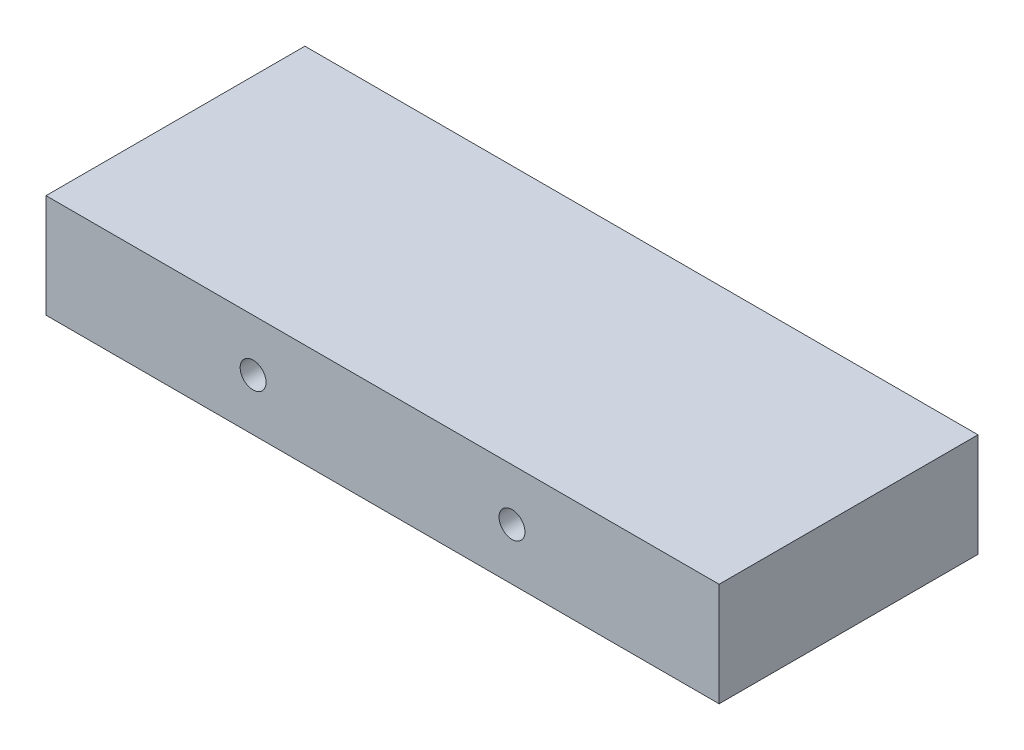
ISO-10303-21;
HEADER;
FILE_DESCRIPTION(('STEP AP214'),'2;1');
FILE_NAME('part.step','',(''),(''),'','','');
FILE_SCHEMA(('AUTOMOTIVE_DESIGN { 1 0 10303 214 1 1 1 1 }'));
ENDSEC;
DATA;
#1=APPLICATION_CONTEXT('core data for automotive mechanical design processes');
#2=APPLICATION_PROTOCOL_DEFINITION('international standard','automotive_design',2000,#1);
#3=PRODUCT_CONTEXT('',#1,'mechanical');
#4=PRODUCT('Part','Part','',(#3));
#5=PRODUCT_RELATED_PRODUCT_CATEGORY('part','',(#4));
#6=PRODUCT_DEFINITION_FORMATION('','',#4);
#7=PRODUCT_DEFINITION_CONTEXT('part definition',#1,'design');
#8=PRODUCT_DEFINITION('design','',#6,#7);
#9=PRODUCT_DEFINITION_SHAPE('','',#8);
#10=(LENGTH_UNIT() NAMED_UNIT(*) SI_UNIT(.MILLI.,.METRE.));
#11=(NAMED_UNIT(*) PLANE_ANGLE_UNIT() SI_UNIT($,.RADIAN.));
#12=(NAMED_UNIT(*) SI_UNIT($,.STERADIAN.) SOLID_ANGLE_UNIT());
#13=UNCERTAINTY_MEASURE_WITH_UNIT(LENGTH_MEASURE(1.E-05),#10,'distance_accuracy_value','');
#14=(GEOMETRIC_REPRESENTATION_CONTEXT(3) GLOBAL_UNCERTAINTY_ASSIGNED_CONTEXT((#13)) GLOBAL_UNIT_ASSIGNED_CONTEXT((#10,
#11,#12)) REPRESENTATION_CONTEXT('',''));
#15=CARTESIAN_POINT('',(0.,0.,0.));
#16=DIRECTION('',(0.,0.,1.));
#17=DIRECTION('',(1.,0.,0.));
#18=AXIS2_PLACEMENT_3D('',#15,#16,#17);
#19=CARTESIAN_POINT('',(25.,0.,34.9999999999682));
#20=DIRECTION('',(0.,0.,1.));
#21=DIRECTION('',(1.,0.,0.));
#22=AXIS2_PLACEMENT_3D('',#19,#20,#21);
#23=CONICAL_SURFACE('',#22,2.49999999980443,1.02974425854011);
#24=CARTESIAN_POINT('',(25.0000000002331,0.,33.4978484524129));
#25=VERTEX_POINT('',#24);
#26=VERTEX_LOOP('',#25);
#27=FACE_BOUND('',#26,.T.);
#28=CARTESIAN_POINT('',(25.,0.,35.));
#29=DIRECTION('',(0.,0.,1.));
#30=DIRECTION('',(1.,0.,0.));
#31=AXIS2_PLACEMENT_3D('',#28,#29,#30);
#32=CIRCLE('',#31,2.5);
#33=CARTESIAN_POINT('',(27.5,0.,35.));
#34=VERTEX_POINT('',#33);
#35=EDGE_CURVE('E65',#34,#34,#32,.T.);
#36=ORIENTED_EDGE('',*,*,#35,.T.);
#37=EDGE_LOOP('',(#36));
#38=FACE_BOUND('',#37,.T.);
#39=ADVANCED_FACE('F17',(#27,#38),#23,.F.);
#40=CARTESIAN_POINT('',(-25.,0.,34.9999999999682));
#41=DIRECTION('',(0.,0.,1.));
#42=DIRECTION('',(1.,0.,0.));
#43=AXIS2_PLACEMENT_3D('',#40,#41,#42);
#44=CONICAL_SURFACE('',#43,2.49999999984991,1.02974425854613);
#45=CARTESIAN_POINT('',(-24.9999999997214,0.,33.4978484523845));
#46=VERTEX_POINT('',#45);
#47=VERTEX_LOOP('',#46);
#48=FACE_BOUND('',#47,.T.);
#49=CARTESIAN_POINT('',(-25.,0.,35.));
#50=DIRECTION('',(0.,0.,1.));
#51=DIRECTION('',(1.,0.,0.));
#52=AXIS2_PLACEMENT_3D('',#49,#50,#51);
#53=CIRCLE('',#52,2.5);
#54=CARTESIAN_POINT('',(-22.5,0.,35.));
#55=VERTEX_POINT('',#54);
#56=EDGE_CURVE('E67',#55,#55,#53,.T.);
#57=ORIENTED_EDGE('',*,*,#56,.T.);
#58=EDGE_LOOP('',(#57));
#59=FACE_BOUND('',#58,.T.);
#60=ADVANCED_FACE('F62',(#48,#59),#44,.F.);
#61=CARTESIAN_POINT('',(25.,0.,50.));
#62=DIRECTION('',(0.,0.,1.));
#63=DIRECTION('',(1.,0.,0.));
#64=AXIS2_PLACEMENT_3D('',#61,#62,#63);
#65=CYLINDRICAL_SURFACE('',#64,2.5);
#66=ORIENTED_EDGE('',*,*,#35,.F.);
#67=EDGE_LOOP('',(#66));
#68=FACE_BOUND('',#67,.T.);
#69=CARTESIAN_POINT('',(25.,0.,50.));
#70=DIRECTION('',(0.,0.,1.));
#71=DIRECTION('',(1.,0.,0.));
#72=AXIS2_PLACEMENT_3D('',#69,#70,#71);
#73=CIRCLE('',#72,2.5);
#74=CARTESIAN_POINT('',(27.5,0.,50.));
#75=VERTEX_POINT('',#74);
#76=EDGE_CURVE('E20',#75,#75,#73,.T.);
#77=ORIENTED_EDGE('',*,*,#76,.T.);
#78=EDGE_LOOP('',(#77));
#79=FACE_BOUND('',#78,.T.);
#80=ADVANCED_FACE('F143',(#68,#79),#65,.F.);
#81=CARTESIAN_POINT('',(-25.,0.,50.));
#82=DIRECTION('',(0.,0.,1.));
#83=DIRECTION('',(1.,0.,0.));
#84=AXIS2_PLACEMENT_3D('',#81,#82,#83);
#85=CYLINDRICAL_SURFACE('',#84,2.5);
#86=ORIENTED_EDGE('',*,*,#56,.F.);
#87=EDGE_LOOP('',(#86));
#88=FACE_BOUND('',#87,.T.);
#89=CARTESIAN_POINT('',(-25.,0.,50.));
#90=DIRECTION('',(0.,0.,1.));
#91=DIRECTION('',(1.,0.,0.));
#92=AXIS2_PLACEMENT_3D('',#89,#90,#91);
#93=CIRCLE('',#92,2.5);
#94=CARTESIAN_POINT('',(-22.5,0.,50.));
#95=VERTEX_POINT('',#94);
#96=EDGE_CURVE('E73',#95,#95,#93,.T.);
#97=ORIENTED_EDGE('',*,*,#96,.T.);
#98=EDGE_LOOP('',(#97));
#99=FACE_BOUND('',#98,.T.);
#100=ADVANCED_FACE('F140',(#88,#99),#85,.F.);
#101=CARTESIAN_POINT('',(-65.,-10.,50.));
#102=DIRECTION('',(0.,1.,0.));
#103=DIRECTION('',(0.,0.,1.));
#104=AXIS2_PLACEMENT_3D('',#101,#102,#103);
#105=PLANE('',#104);
#106=DIRECTION('',(0.,0.,1.));
#107=VECTOR('',#106,1.);
#108=CARTESIAN_POINT('',(65.,-10.,50.));
#109=LINE('',#108,#107);
#110=CARTESIAN_POINT('',(65.,-10.,0.));
#111=VERTEX_POINT('',#110);
#112=CARTESIAN_POINT('',(65.,-10.,50.));
#113=VERTEX_POINT('',#112);
#114=EDGE_CURVE('E70',#111,#113,#109,.T.);
#115=ORIENTED_EDGE('',*,*,#114,.T.);
#116=DIRECTION('',(-1.,0.,0.));
#117=VECTOR('',#116,1.);
#118=CARTESIAN_POINT('',(0.,-10.,50.));
#119=LINE('',#118,#117);
#120=CARTESIAN_POINT('',(-65.,-10.,50.));
#121=VERTEX_POINT('',#120);
#122=EDGE_CURVE('E75',#113,#121,#119,.T.);
#123=ORIENTED_EDGE('',*,*,#122,.T.);
#124=DIRECTION('',(0.,0.,-1.));
#125=VECTOR('',#124,1.);
#126=CARTESIAN_POINT('',(-65.,-10.,50.));
#127=LINE('',#126,#125);
#128=CARTESIAN_POINT('',(-65.,-10.,0.));
#129=VERTEX_POINT('',#128);
#130=EDGE_CURVE('E92',#121,#129,#127,.T.);
#131=ORIENTED_EDGE('',*,*,#130,.T.);
#132=DIRECTION('',(-1.,0.,0.));
#133=VECTOR('',#132,1.);
#134=CARTESIAN_POINT('',(0.,-10.,0.));
#135=LINE('',#134,#133);
#136=EDGE_CURVE('E98',#111,#129,#135,.T.);
#137=ORIENTED_EDGE('',*,*,#136,.F.);
#138=EDGE_LOOP('',(#115,#123,#131,#137));
#139=FACE_BOUND('',#138,.T.);
#140=ADVANCED_FACE('F137',(#139),#105,.F.);
#141=CARTESIAN_POINT('',(65.,-10.,50.));
#142=DIRECTION('',(-1.,0.,0.));
#143=DIRECTION('',(0.,0.,1.));
#144=AXIS2_PLACEMENT_3D('',#141,#142,#143);
#145=PLANE('',#144);
#146=DIRECTION('',(0.,0.,-1.));
#147=VECTOR('',#146,1.);
#148=CARTESIAN_POINT('',(65.,10.,50.));
#149=LINE('',#148,#147);
#150=CARTESIAN_POINT('',(65.,10.,0.));
#151=VERTEX_POINT('',#150);
#152=CARTESIAN_POINT('',(65.,10.,50.));
#153=VERTEX_POINT('',#152);
#154=EDGE_CURVE('E101',#151,#153,#149,.F.);
#155=ORIENTED_EDGE('',*,*,#154,.T.);
#156=DIRECTION('',(0.,1.,0.));
#157=VECTOR('',#156,1.);
#158=CARTESIAN_POINT('',(65.,0.,50.));
#159=LINE('',#158,#157);
#160=EDGE_CURVE('E78',#153,#113,#159,.F.);
#161=ORIENTED_EDGE('',*,*,#160,.T.);
#162=ORIENTED_EDGE('',*,*,#114,.F.);
#163=DIRECTION('',(0.,1.,0.));
#164=VECTOR('',#163,1.);
#165=CARTESIAN_POINT('',(65.,0.,0.));
#166=LINE('',#165,#164);
#167=EDGE_CURVE('E95',#151,#111,#166,.F.);
#168=ORIENTED_EDGE('',*,*,#167,.F.);
#169=EDGE_LOOP('',(#155,#161,#162,#168));
#170=FACE_BOUND('',#169,.T.);
#171=ADVANCED_FACE('F119',(#170),#145,.F.);
#172=CARTESIAN_POINT('',(0.,0.,50.));
#173=DIRECTION('',(0.,0.,-1.));
#174=DIRECTION('',(-1.,0.,0.));
#175=AXIS2_PLACEMENT_3D('',#172,#173,#174);
#176=PLANE('',#175);
#177=DIRECTION('',(1.,0.,0.));
#178=VECTOR('',#177,1.);
#179=CARTESIAN_POINT('',(-65.,10.,50.));
#180=LINE('',#179,#178);
#181=CARTESIAN_POINT('',(-65.,10.,50.));
#182=VERTEX_POINT('',#181);
#183=EDGE_CURVE('E104',#153,#182,#180,.F.);
#184=ORIENTED_EDGE('',*,*,#183,.T.);
#185=DIRECTION('',(0.,1.,0.));
#186=VECTOR('',#185,1.);
#187=CARTESIAN_POINT('',(-65.,-10.,50.));
#188=LINE('',#187,#186);
#189=EDGE_CURVE('E89',#182,#121,#188,.F.);
#190=ORIENTED_EDGE('',*,*,#189,.T.);
#191=ORIENTED_EDGE('',*,*,#122,.F.);
#192=ORIENTED_EDGE('',*,*,#160,.F.);
#193=EDGE_LOOP('',(#184,#190,#191,#192));
#194=FACE_BOUND('',#193,.T.);
#195=ORIENTED_EDGE('',*,*,#96,.F.);
#196=EDGE_LOOP('',(#195));
#197=FACE_BOUND('',#196,.T.);
#198=ORIENTED_EDGE('',*,*,#76,.F.);
#199=EDGE_LOOP('',(#198));
#200=FACE_BOUND('',#199,.T.);
#201=ADVANCED_FACE('F116',(#194,#197,#200),#176,.F.);
#202=CARTESIAN_POINT('',(-65.,-10.,50.));
#203=DIRECTION('',(1.,0.,0.));
#204=DIRECTION('',(0.,0.,-1.));
#205=AXIS2_PLACEMENT_3D('',#202,#203,#204);
#206=PLANE('',#205);
#207=ORIENTED_EDGE('',*,*,#130,.F.);
#208=ORIENTED_EDGE('',*,*,#189,.F.);
#209=DIRECTION('',(0.,0.,-1.));
#210=VECTOR('',#209,1.);
#211=CARTESIAN_POINT('',(-65.,10.,50.));
#212=LINE('',#211,#210);
#213=CARTESIAN_POINT('',(-65.,10.,0.));
#214=VERTEX_POINT('',#213);
#215=EDGE_CURVE('E26',#182,#214,#212,.T.);
#216=ORIENTED_EDGE('',*,*,#215,.T.);
#217=DIRECTION('',(0.,1.,0.));
#218=VECTOR('',#217,1.);
#219=CARTESIAN_POINT('',(-65.,0.,0.));
#220=LINE('',#219,#218);
#221=EDGE_CURVE('E34',#129,#214,#220,.T.);
#222=ORIENTED_EDGE('',*,*,#221,.F.);
#223=EDGE_LOOP('',(#207,#208,#216,#222));
#224=FACE_BOUND('',#223,.T.);
#225=ADVANCED_FACE('F111',(#224),#206,.F.);
#226=CARTESIAN_POINT('',(0.,0.,0.));
#227=DIRECTION('',(0.,0.,-1.));
#228=DIRECTION('',(-1.,0.,0.));
#229=AXIS2_PLACEMENT_3D('',#226,#227,#228);
#230=PLANE('',#229);
#231=ORIENTED_EDGE('',*,*,#221,.T.);
#232=DIRECTION('',(1.,0.,0.));
#233=VECTOR('',#232,1.);
#234=CARTESIAN_POINT('',(-65.,10.,0.));
#235=LINE('',#234,#233);
#236=EDGE_CURVE('E11',#214,#151,#235,.T.);
#237=ORIENTED_EDGE('',*,*,#236,.T.);
#238=ORIENTED_EDGE('',*,*,#167,.T.);
#239=ORIENTED_EDGE('',*,*,#136,.T.);
#240=EDGE_LOOP('',(#231,#237,#238,#239));
#241=FACE_BOUND('',#240,.T.);
#242=ADVANCED_FACE('F121',(#241),#230,.T.);
#243=CARTESIAN_POINT('',(-65.,10.,50.));
#244=DIRECTION('',(0.,-1.,0.));
#245=DIRECTION('',(0.,0.,-1.));
#246=AXIS2_PLACEMENT_3D('',#243,#244,#245);
#247=PLANE('',#246);
#248=ORIENTED_EDGE('',*,*,#215,.F.);
#249=ORIENTED_EDGE('',*,*,#183,.F.);
#250=ORIENTED_EDGE('',*,*,#154,.F.);
#251=ORIENTED_EDGE('',*,*,#236,.F.);
#252=EDGE_LOOP('',(#248,#249,#250,#251));
#253=FACE_BOUND('',#252,.T.);
#254=ADVANCED_FACE('F114',(#253),#247,.F.);
#255=CLOSED_SHELL('',(#39,#60,#80,#100,#140,#171,#201,#225,#242,#254));
#256=MANIFOLD_SOLID_BREP('B1',#255);
#257=ADVANCED_BREP_SHAPE_REPRESENTATION('',(#18,#256),#14);
#258=SHAPE_DEFINITION_REPRESENTATION(#9,#257);
ENDSEC;
END-ISO-10303-21;
